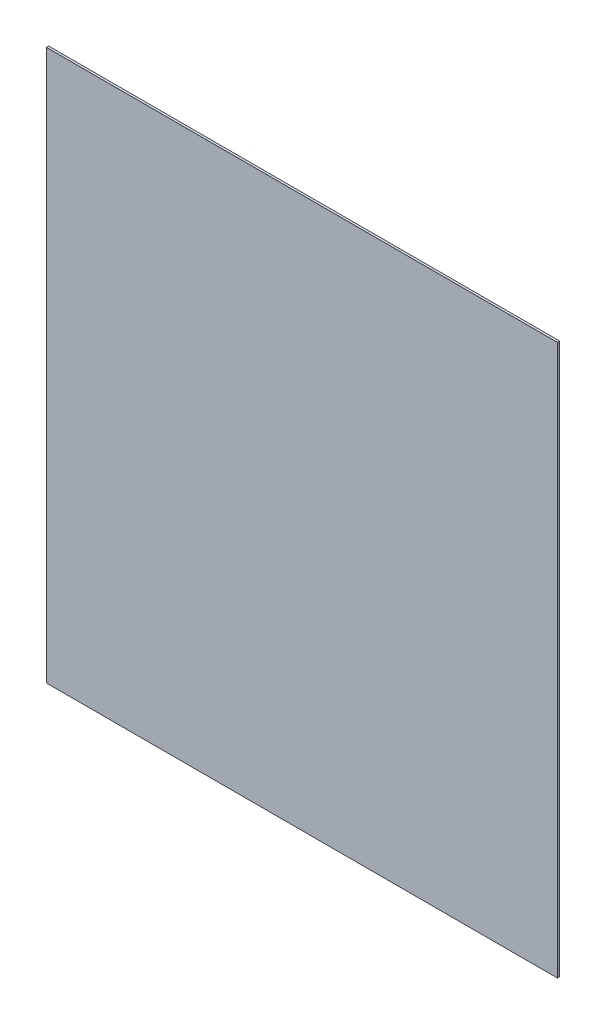
ISO-10303-21;
HEADER;
FILE_DESCRIPTION(('STEP AP214'),'2;1');
FILE_NAME('part.step','',(''),(''),'','','');
FILE_SCHEMA(('AUTOMOTIVE_DESIGN { 1 0 10303 214 1 1 1 1 }'));
ENDSEC;
DATA;
#1=APPLICATION_CONTEXT('core data for automotive mechanical design processes');
#2=APPLICATION_PROTOCOL_DEFINITION('international standard','automotive_design',2000,#1);
#3=PRODUCT_CONTEXT('',#1,'mechanical');
#4=PRODUCT('Part','Part','',(#3));
#5=PRODUCT_RELATED_PRODUCT_CATEGORY('part','',(#4));
#6=PRODUCT_DEFINITION_FORMATION('','',#4);
#7=PRODUCT_DEFINITION_CONTEXT('part definition',#1,'design');
#8=PRODUCT_DEFINITION('design','',#6,#7);
#9=PRODUCT_DEFINITION_SHAPE('','',#8);
#10=(LENGTH_UNIT() NAMED_UNIT(*) SI_UNIT(.MILLI.,.METRE.));
#11=(NAMED_UNIT(*) PLANE_ANGLE_UNIT() SI_UNIT($,.RADIAN.));
#12=(NAMED_UNIT(*) SI_UNIT($,.STERADIAN.) SOLID_ANGLE_UNIT());
#13=UNCERTAINTY_MEASURE_WITH_UNIT(LENGTH_MEASURE(1.E-05),#10,'distance_accuracy_value','');
#14=(GEOMETRIC_REPRESENTATION_CONTEXT(3) GLOBAL_UNCERTAINTY_ASSIGNED_CONTEXT((#13)) GLOBAL_UNIT_ASSIGNED_CONTEXT((#10,
#11,#12)) REPRESENTATION_CONTEXT('',''));
#15=CARTESIAN_POINT('',(0.,0.,0.));
#16=DIRECTION('',(0.,0.,1.));
#17=DIRECTION('',(1.,0.,0.));
#18=AXIS2_PLACEMENT_3D('',#15,#16,#17);
#19=CARTESIAN_POINT('',(279.4,-300.99,2.54));
#20=DIRECTION('',(-1.,0.,0.));
#21=DIRECTION('',(0.,0.,1.));
#22=AXIS2_PLACEMENT_3D('',#19,#20,#21);
#23=PLANE('',#22);
#24=DIRECTION('',(0.,1.,0.));
#25=VECTOR('',#24,1.);
#26=CARTESIAN_POINT('',(279.4,-300.99,0.));
#27=LINE('',#26,#25);
#28=CARTESIAN_POINT('',(279.4,-300.99,0.));
#29=VERTEX_POINT('',#28);
#30=CARTESIAN_POINT('',(279.4,300.99,0.));
#31=VERTEX_POINT('',#30);
#32=EDGE_CURVE('E117',#29,#31,#27,.T.);
#33=ORIENTED_EDGE('',*,*,#32,.T.);
#34=DIRECTION('',(0.,0.,-1.));
#35=VECTOR('',#34,1.);
#36=CARTESIAN_POINT('',(279.4,300.99,2.54));
#37=LINE('',#36,#35);
#38=CARTESIAN_POINT('',(279.4,300.99,2.54));
#39=VERTEX_POINT('',#38);
#40=EDGE_CURVE('E12',#39,#31,#37,.T.);
#41=ORIENTED_EDGE('',*,*,#40,.F.);
#42=DIRECTION('',(0.,1.,0.));
#43=VECTOR('',#42,1.);
#44=CARTESIAN_POINT('',(279.4,-300.99,2.54));
#45=LINE('',#44,#43);
#46=CARTESIAN_POINT('',(279.4,-300.99,2.54));
#47=VERTEX_POINT('',#46);
#48=EDGE_CURVE('E86',#47,#39,#45,.T.);
#49=ORIENTED_EDGE('',*,*,#48,.F.);
#50=DIRECTION('',(0.,0.,-1.));
#51=VECTOR('',#50,1.);
#52=CARTESIAN_POINT('',(279.4,-300.99,2.54));
#53=LINE('',#52,#51);
#54=EDGE_CURVE('E97',#47,#29,#53,.T.);
#55=ORIENTED_EDGE('',*,*,#54,.T.);
#56=EDGE_LOOP('',(#33,#41,#49,#55));
#57=FACE_BOUND('',#56,.T.);
#58=ADVANCED_FACE('F35',(#57),#23,.F.);
#59=CARTESIAN_POINT('',(-279.4,300.99,2.54));
#60=DIRECTION('',(0.,-1.,0.));
#61=DIRECTION('',(0.,0.,-1.));
#62=AXIS2_PLACEMENT_3D('',#59,#60,#61);
#63=PLANE('',#62);
#64=DIRECTION('',(-1.,0.,0.));
#65=VECTOR('',#64,1.);
#66=CARTESIAN_POINT('',(-279.4,300.99,0.));
#67=LINE('',#66,#65);
#68=CARTESIAN_POINT('',(-279.4,300.99,0.));
#69=VERTEX_POINT('',#68);
#70=EDGE_CURVE('E91',#31,#69,#67,.T.);
#71=ORIENTED_EDGE('',*,*,#70,.T.);
#72=DIRECTION('',(0.,0.,-1.));
#73=VECTOR('',#72,1.);
#74=CARTESIAN_POINT('',(-279.4,300.99,2.54));
#75=LINE('',#74,#73);
#76=CARTESIAN_POINT('',(-279.4,300.99,2.54));
#77=VERTEX_POINT('',#76);
#78=EDGE_CURVE('E43',#77,#69,#75,.T.);
#79=ORIENTED_EDGE('',*,*,#78,.F.);
#80=DIRECTION('',(-1.,0.,0.));
#81=VECTOR('',#80,1.);
#82=CARTESIAN_POINT('',(-279.4,300.99,2.54));
#83=LINE('',#82,#81);
#84=EDGE_CURVE('E81',#39,#77,#83,.T.);
#85=ORIENTED_EDGE('',*,*,#84,.F.);
#86=ORIENTED_EDGE('',*,*,#40,.T.);
#87=EDGE_LOOP('',(#71,#79,#85,#86));
#88=FACE_BOUND('',#87,.T.);
#89=ADVANCED_FACE('F90',(#88),#63,.F.);
#90=CARTESIAN_POINT('',(-279.4,-300.99,2.54));
#91=DIRECTION('',(1.,0.,0.));
#92=DIRECTION('',(0.,0.,-1.));
#93=AXIS2_PLACEMENT_3D('',#90,#91,#92);
#94=PLANE('',#93);
#95=DIRECTION('',(0.,-1.,0.));
#96=VECTOR('',#95,1.);
#97=CARTESIAN_POINT('',(-279.4,-300.99,0.));
#98=LINE('',#97,#96);
#99=CARTESIAN_POINT('',(-279.4,-300.99,0.));
#100=VERTEX_POINT('',#99);
#101=EDGE_CURVE('E68',#69,#100,#98,.T.);
#102=ORIENTED_EDGE('',*,*,#101,.T.);
#103=DIRECTION('',(0.,0.,-1.));
#104=VECTOR('',#103,1.);
#105=CARTESIAN_POINT('',(-279.4,-300.99,2.54));
#106=LINE('',#105,#104);
#107=CARTESIAN_POINT('',(-279.4,-300.99,2.54));
#108=VERTEX_POINT('',#107);
#109=EDGE_CURVE('E92',#108,#100,#106,.T.);
#110=ORIENTED_EDGE('',*,*,#109,.F.);
#111=DIRECTION('',(0.,-1.,0.));
#112=VECTOR('',#111,1.);
#113=CARTESIAN_POINT('',(-279.4,-300.99,2.54));
#114=LINE('',#113,#112);
#115=EDGE_CURVE('E84',#77,#108,#114,.T.);
#116=ORIENTED_EDGE('',*,*,#115,.F.);
#117=ORIENTED_EDGE('',*,*,#78,.T.);
#118=EDGE_LOOP('',(#102,#110,#116,#117));
#119=FACE_BOUND('',#118,.T.);
#120=ADVANCED_FACE('F93',(#119),#94,.F.);
#121=CARTESIAN_POINT('',(-279.4,-300.99,2.54));
#122=DIRECTION('',(0.,1.,0.));
#123=DIRECTION('',(0.,0.,1.));
#124=AXIS2_PLACEMENT_3D('',#121,#122,#123);
#125=PLANE('',#124);
#126=DIRECTION('',(1.,0.,0.));
#127=VECTOR('',#126,1.);
#128=CARTESIAN_POINT('',(-279.4,-300.99,0.));
#129=LINE('',#128,#127);
#130=EDGE_CURVE('E74',#100,#29,#129,.T.);
#131=ORIENTED_EDGE('',*,*,#130,.T.);
#132=ORIENTED_EDGE('',*,*,#54,.F.);
#133=DIRECTION('',(1.,0.,0.));
#134=VECTOR('',#133,1.);
#135=CARTESIAN_POINT('',(-279.4,-300.99,2.54));
#136=LINE('',#135,#134);
#137=EDGE_CURVE('E51',#108,#47,#136,.T.);
#138=ORIENTED_EDGE('',*,*,#137,.F.);
#139=ORIENTED_EDGE('',*,*,#109,.T.);
#140=EDGE_LOOP('',(#131,#132,#138,#139));
#141=FACE_BOUND('',#140,.T.);
#142=ADVANCED_FACE('F112',(#141),#125,.F.);
#143=CARTESIAN_POINT('',(0.,0.,2.54));
#144=DIRECTION('',(0.,0.,-1.));
#145=DIRECTION('',(-1.,0.,0.));
#146=AXIS2_PLACEMENT_3D('',#143,#144,#145);
#147=PLANE('',#146);
#148=ORIENTED_EDGE('',*,*,#48,.T.);
#149=ORIENTED_EDGE('',*,*,#84,.T.);
#150=ORIENTED_EDGE('',*,*,#115,.T.);
#151=ORIENTED_EDGE('',*,*,#137,.T.);
#152=EDGE_LOOP('',(#148,#149,#150,#151));
#153=FACE_BOUND('',#152,.T.);
#154=ADVANCED_FACE('F82',(#153),#147,.F.);
#155=CARTESIAN_POINT('',(0.,0.,0.));
#156=DIRECTION('',(0.,0.,-1.));
#157=DIRECTION('',(-1.,0.,0.));
#158=AXIS2_PLACEMENT_3D('',#155,#156,#157);
#159=PLANE('',#158);
#160=ORIENTED_EDGE('',*,*,#32,.F.);
#161=ORIENTED_EDGE('',*,*,#130,.F.);
#162=ORIENTED_EDGE('',*,*,#101,.F.);
#163=ORIENTED_EDGE('',*,*,#70,.F.);
#164=EDGE_LOOP('',(#160,#161,#162,#163));
#165=FACE_BOUND('',#164,.T.);
#166=ADVANCED_FACE('F115',(#165),#159,.T.);
#167=CLOSED_SHELL('',(#58,#89,#120,#142,#154,#166));
#168=MANIFOLD_SOLID_BREP('B2',#167);
#169=ADVANCED_BREP_SHAPE_REPRESENTATION('',(#18,#168),#14);
#170=SHAPE_DEFINITION_REPRESENTATION(#9,#169);
ENDSEC;
END-ISO-10303-21;
